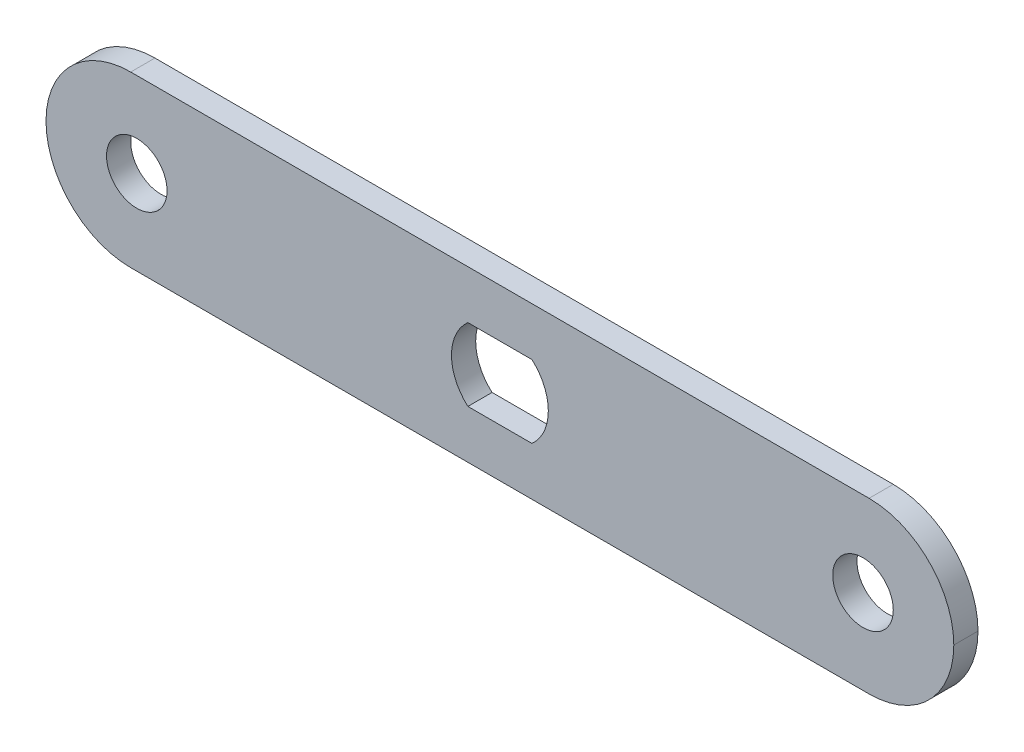
ISO-10303-21;
HEADER;
FILE_DESCRIPTION(('STEP AP214'),'2;1');
FILE_NAME('part.step','',(''),(''),'','','');
FILE_SCHEMA(('AUTOMOTIVE_DESIGN { 1 0 10303 214 1 1 1 1 }'));
ENDSEC;
DATA;
#1=APPLICATION_CONTEXT('core data for automotive mechanical design processes');
#2=APPLICATION_PROTOCOL_DEFINITION('international standard','automotive_design',2000,#1);
#3=PRODUCT_CONTEXT('',#1,'mechanical');
#4=PRODUCT('Part','Part','',(#3));
#5=PRODUCT_RELATED_PRODUCT_CATEGORY('part','',(#4));
#6=PRODUCT_DEFINITION_FORMATION('','',#4);
#7=PRODUCT_DEFINITION_CONTEXT('part definition',#1,'design');
#8=PRODUCT_DEFINITION('design','',#6,#7);
#9=PRODUCT_DEFINITION_SHAPE('','',#8);
#10=(LENGTH_UNIT() NAMED_UNIT(*) SI_UNIT(.MILLI.,.METRE.));
#11=(NAMED_UNIT(*) PLANE_ANGLE_UNIT() SI_UNIT($,.RADIAN.));
#12=(NAMED_UNIT(*) SI_UNIT($,.STERADIAN.) SOLID_ANGLE_UNIT());
#13=UNCERTAINTY_MEASURE_WITH_UNIT(LENGTH_MEASURE(1.E-05),#10,'distance_accuracy_value','');
#14=(GEOMETRIC_REPRESENTATION_CONTEXT(3) GLOBAL_UNCERTAINTY_ASSIGNED_CONTEXT((#13)) GLOBAL_UNIT_ASSIGNED_CONTEXT((#10,
#11,#12)) REPRESENTATION_CONTEXT('',''));
#15=CARTESIAN_POINT('',(0.,0.,0.));
#16=DIRECTION('',(0.,0.,1.));
#17=DIRECTION('',(1.,0.,0.));
#18=AXIS2_PLACEMENT_3D('',#15,#16,#17);
#19=CARTESIAN_POINT('',(0.,0.,2.));
#20=DIRECTION('',(0.,0.,-1.));
#21=DIRECTION('',(-1.,0.,0.));
#22=AXIS2_PLACEMENT_3D('',#19,#20,#21);
#23=PLANE('',#22);
#24=DIRECTION('',(1.,0.,0.));
#25=VECTOR('',#24,1.);
#26=CARTESIAN_POINT('',(-37.5,-7.,2.));
#27=LINE('',#26,#25);
#28=CARTESIAN_POINT('',(-30.5,-7.,2.));
#29=VERTEX_POINT('',#28);
#30=CARTESIAN_POINT('',(30.5,-7.,2.));
#31=VERTEX_POINT('',#30);
#32=EDGE_CURVE('E191',#29,#31,#27,.T.);
#33=ORIENTED_EDGE('',*,*,#32,.T.);
#34=CARTESIAN_POINT('',(30.5,0.,2.));
#35=DIRECTION('',(0.,0.,-1.));
#36=DIRECTION('',(-1.,0.,0.));
#37=AXIS2_PLACEMENT_3D('',#34,#35,#36);
#38=CIRCLE('',#37,7.);
#39=CARTESIAN_POINT('',(37.5,0.,2.));
#40=VERTEX_POINT('',#39);
#41=EDGE_CURVE('E226',#31,#40,#38,.F.);
#42=ORIENTED_EDGE('',*,*,#41,.T.);
#43=CARTESIAN_POINT('',(30.5,0.,2.));
#44=DIRECTION('',(0.,0.,-1.));
#45=DIRECTION('',(-1.,0.,0.));
#46=AXIS2_PLACEMENT_3D('',#43,#44,#45);
#47=CIRCLE('',#46,7.);
#48=CARTESIAN_POINT('',(30.5,7.,2.));
#49=VERTEX_POINT('',#48);
#50=EDGE_CURVE('E223',#40,#49,#47,.F.);
#51=ORIENTED_EDGE('',*,*,#50,.T.);
#52=DIRECTION('',(-1.,0.,0.));
#53=VECTOR('',#52,1.);
#54=CARTESIAN_POINT('',(-37.5,7.,2.));
#55=LINE('',#54,#53);
#56=CARTESIAN_POINT('',(-30.5,7.,2.));
#57=VERTEX_POINT('',#56);
#58=EDGE_CURVE('E200',#49,#57,#55,.T.);
#59=ORIENTED_EDGE('',*,*,#58,.T.);
#60=CARTESIAN_POINT('',(-30.5,0.,2.));
#61=DIRECTION('',(0.,0.,-1.));
#62=DIRECTION('',(-1.,0.,0.));
#63=AXIS2_PLACEMENT_3D('',#60,#61,#62);
#64=CIRCLE('',#63,7.);
#65=CARTESIAN_POINT('',(-37.5,0.,2.));
#66=VERTEX_POINT('',#65);
#67=EDGE_CURVE('E217',#57,#66,#64,.F.);
#68=ORIENTED_EDGE('',*,*,#67,.T.);
#69=CARTESIAN_POINT('',(-30.5,0.,2.));
#70=DIRECTION('',(0.,0.,-1.));
#71=DIRECTION('',(-1.,0.,0.));
#72=AXIS2_PLACEMENT_3D('',#69,#70,#71);
#73=CIRCLE('',#72,7.);
#74=EDGE_CURVE('E220',#66,#29,#73,.F.);
#75=ORIENTED_EDGE('',*,*,#74,.T.);
#76=EDGE_LOOP('',(#33,#42,#51,#59,#68,#75));
#77=FACE_BOUND('',#76,.T.);
#78=CARTESIAN_POINT('',(-30.,0.,2.));
#79=DIRECTION('',(0.,0.,1.));
#80=DIRECTION('',(1.,0.,0.));
#81=AXIS2_PLACEMENT_3D('',#78,#79,#80);
#82=CIRCLE('',#81,2.5);
#83=CARTESIAN_POINT('',(-27.5,0.,2.));
#84=VERTEX_POINT('',#83);
#85=EDGE_CURVE('E183',#84,#84,#82,.T.);
#86=ORIENTED_EDGE('',*,*,#85,.F.);
#87=EDGE_LOOP('',(#86));
#88=FACE_BOUND('',#87,.T.);
#89=CARTESIAN_POINT('',(30.,0.,2.));
#90=DIRECTION('',(0.,0.,1.));
#91=DIRECTION('',(1.,0.,0.));
#92=AXIS2_PLACEMENT_3D('',#89,#90,#91);
#93=CIRCLE('',#92,2.5);
#94=CARTESIAN_POINT('',(32.5,0.,2.));
#95=VERTEX_POINT('',#94);
#96=EDGE_CURVE('E145',#95,#95,#93,.T.);
#97=ORIENTED_EDGE('',*,*,#96,.F.);
#98=EDGE_LOOP('',(#97));
#99=FACE_BOUND('',#98,.T.);
#100=CARTESIAN_POINT('',(0.,0.,2.));
#101=DIRECTION('',(0.,0.,1.));
#102=DIRECTION('',(-1.,0.,0.));
#103=AXIS2_PLACEMENT_3D('',#100,#101,#102);
#104=CIRCLE('',#103,4.);
#105=CARTESIAN_POINT('',(2.64575131106459,-3.,2.));
#106=VERTEX_POINT('',#105);
#107=CARTESIAN_POINT('',(2.64575131106459,3.,2.));
#108=VERTEX_POINT('',#107);
#109=EDGE_CURVE('E125',#106,#108,#104,.T.);
#110=ORIENTED_EDGE('',*,*,#109,.F.);
#111=DIRECTION('',(1.,0.,0.));
#112=VECTOR('',#111,1.);
#113=CARTESIAN_POINT('',(-2.64575131106459,-3.,2.));
#114=LINE('',#113,#112);
#115=CARTESIAN_POINT('',(-2.64575131106459,-3.,2.));
#116=VERTEX_POINT('',#115);
#117=EDGE_CURVE('E154',#116,#106,#114,.T.);
#118=ORIENTED_EDGE('',*,*,#117,.F.);
#119=CARTESIAN_POINT('',(0.,0.,2.));
#120=DIRECTION('',(0.,0.,1.));
#121=DIRECTION('',(1.,0.,0.));
#122=AXIS2_PLACEMENT_3D('',#119,#120,#121);
#123=CIRCLE('',#122,4.);
#124=CARTESIAN_POINT('',(-2.64575131106459,3.,2.));
#125=VERTEX_POINT('',#124);
#126=EDGE_CURVE('E150',#125,#116,#123,.T.);
#127=ORIENTED_EDGE('',*,*,#126,.F.);
#128=DIRECTION('',(-1.,0.,0.));
#129=VECTOR('',#128,1.);
#130=CARTESIAN_POINT('',(-2.64575131106459,3.,2.));
#131=LINE('',#130,#129);
#132=EDGE_CURVE('E136',#108,#125,#131,.T.);
#133=ORIENTED_EDGE('',*,*,#132,.F.);
#134=EDGE_LOOP('',(#110,#118,#127,#133));
#135=FACE_BOUND('',#134,.T.);
#136=ADVANCED_FACE('F45',(#77,#88,#99,#135),#23,.F.);
#137=CARTESIAN_POINT('',(0.,0.,0.));
#138=DIRECTION('',(0.,0.,-1.));
#139=DIRECTION('',(-1.,0.,0.));
#140=AXIS2_PLACEMENT_3D('',#137,#138,#139);
#141=PLANE('',#140);
#142=CARTESIAN_POINT('',(30.5,0.,0.));
#143=DIRECTION('',(0.,0.,-1.));
#144=DIRECTION('',(-1.,0.,0.));
#145=AXIS2_PLACEMENT_3D('',#142,#143,#144);
#146=CIRCLE('',#145,7.);
#147=CARTESIAN_POINT('',(30.5,7.,0.));
#148=VERTEX_POINT('',#147);
#149=CARTESIAN_POINT('',(37.5,0.,0.));
#150=VERTEX_POINT('',#149);
#151=EDGE_CURVE('E63',#148,#150,#146,.T.);
#152=ORIENTED_EDGE('',*,*,#151,.T.);
#153=CARTESIAN_POINT('',(30.5,0.,0.));
#154=DIRECTION('',(0.,0.,-1.));
#155=DIRECTION('',(-1.,0.,0.));
#156=AXIS2_PLACEMENT_3D('',#153,#154,#155);
#157=CIRCLE('',#156,7.);
#158=CARTESIAN_POINT('',(30.5,-7.,0.));
#159=VERTEX_POINT('',#158);
#160=EDGE_CURVE('E236',#150,#159,#157,.T.);
#161=ORIENTED_EDGE('',*,*,#160,.T.);
#162=DIRECTION('',(1.,0.,0.));
#163=VECTOR('',#162,1.);
#164=CARTESIAN_POINT('',(-37.5,-7.,0.));
#165=LINE('',#164,#163);
#166=CARTESIAN_POINT('',(-30.5,-7.,0.));
#167=VERTEX_POINT('',#166);
#168=EDGE_CURVE('E195',#167,#159,#165,.T.);
#169=ORIENTED_EDGE('',*,*,#168,.F.);
#170=CARTESIAN_POINT('',(-30.5,0.,0.));
#171=DIRECTION('',(0.,0.,-1.));
#172=DIRECTION('',(-1.,0.,0.));
#173=AXIS2_PLACEMENT_3D('',#170,#171,#172);
#174=CIRCLE('',#173,7.);
#175=CARTESIAN_POINT('',(-37.5,0.,0.));
#176=VERTEX_POINT('',#175);
#177=EDGE_CURVE('E231',#167,#176,#174,.T.);
#178=ORIENTED_EDGE('',*,*,#177,.T.);
#179=CARTESIAN_POINT('',(-30.5,0.,0.));
#180=DIRECTION('',(0.,0.,-1.));
#181=DIRECTION('',(-1.,0.,0.));
#182=AXIS2_PLACEMENT_3D('',#179,#180,#181);
#183=CIRCLE('',#182,7.);
#184=CARTESIAN_POINT('',(-30.5,7.,0.));
#185=VERTEX_POINT('',#184);
#186=EDGE_CURVE('E69',#176,#185,#183,.T.);
#187=ORIENTED_EDGE('',*,*,#186,.T.);
#188=DIRECTION('',(-1.,0.,0.));
#189=VECTOR('',#188,1.);
#190=CARTESIAN_POINT('',(-37.5,7.,0.));
#191=LINE('',#190,#189);
#192=EDGE_CURVE('E199',#148,#185,#191,.T.);
#193=ORIENTED_EDGE('',*,*,#192,.F.);
#194=EDGE_LOOP('',(#152,#161,#169,#178,#187,#193));
#195=FACE_BOUND('',#194,.T.);
#196=CARTESIAN_POINT('',(-30.,0.,0.));
#197=DIRECTION('',(0.,0.,1.));
#198=DIRECTION('',(1.,0.,0.));
#199=AXIS2_PLACEMENT_3D('',#196,#197,#198);
#200=CIRCLE('',#199,2.5);
#201=CARTESIAN_POINT('',(-27.5,0.,0.));
#202=VERTEX_POINT('',#201);
#203=EDGE_CURVE('E187',#202,#202,#200,.T.);
#204=ORIENTED_EDGE('',*,*,#203,.T.);
#205=EDGE_LOOP('',(#204));
#206=FACE_BOUND('',#205,.T.);
#207=CARTESIAN_POINT('',(30.,0.,0.));
#208=DIRECTION('',(0.,0.,1.));
#209=DIRECTION('',(1.,0.,0.));
#210=AXIS2_PLACEMENT_3D('',#207,#208,#209);
#211=CIRCLE('',#210,2.5);
#212=CARTESIAN_POINT('',(32.5,0.,0.));
#213=VERTEX_POINT('',#212);
#214=EDGE_CURVE('E179',#213,#213,#211,.T.);
#215=ORIENTED_EDGE('',*,*,#214,.T.);
#216=EDGE_LOOP('',(#215));
#217=FACE_BOUND('',#216,.T.);
#218=DIRECTION('',(1.,0.,0.));
#219=VECTOR('',#218,1.);
#220=CARTESIAN_POINT('',(-2.64575131106459,-3.,0.));
#221=LINE('',#220,#219);
#222=CARTESIAN_POINT('',(-2.64575131106459,-3.,0.));
#223=VERTEX_POINT('',#222);
#224=CARTESIAN_POINT('',(2.64575131106459,-3.,0.));
#225=VERTEX_POINT('',#224);
#226=EDGE_CURVE('E137',#223,#225,#221,.T.);
#227=ORIENTED_EDGE('',*,*,#226,.T.);
#228=CARTESIAN_POINT('',(0.,0.,0.));
#229=DIRECTION('',(0.,0.,1.));
#230=DIRECTION('',(-1.,0.,0.));
#231=AXIS2_PLACEMENT_3D('',#228,#229,#230);
#232=CIRCLE('',#231,4.);
#233=CARTESIAN_POINT('',(2.64575131106459,3.,0.));
#234=VERTEX_POINT('',#233);
#235=EDGE_CURVE('E159',#225,#234,#232,.T.);
#236=ORIENTED_EDGE('',*,*,#235,.T.);
#237=DIRECTION('',(-1.,0.,0.));
#238=VECTOR('',#237,1.);
#239=CARTESIAN_POINT('',(-2.64575131106459,3.,0.));
#240=LINE('',#239,#238);
#241=CARTESIAN_POINT('',(-2.64575131106459,3.,0.));
#242=VERTEX_POINT('',#241);
#243=EDGE_CURVE('E143',#234,#242,#240,.T.);
#244=ORIENTED_EDGE('',*,*,#243,.T.);
#245=CARTESIAN_POINT('',(0.,0.,0.));
#246=DIRECTION('',(0.,0.,1.));
#247=DIRECTION('',(1.,0.,0.));
#248=AXIS2_PLACEMENT_3D('',#245,#246,#247);
#249=CIRCLE('',#248,4.);
#250=EDGE_CURVE('E165',#242,#223,#249,.T.);
#251=ORIENTED_EDGE('',*,*,#250,.T.);
#252=EDGE_LOOP('',(#227,#236,#244,#251));
#253=FACE_BOUND('',#252,.T.);
#254=ADVANCED_FACE('F263',(#195,#206,#217,#253),#141,.T.);
#255=CARTESIAN_POINT('',(-37.5,-7.,0.));
#256=DIRECTION('',(0.,-1.,0.));
#257=DIRECTION('',(0.,0.,-1.));
#258=AXIS2_PLACEMENT_3D('',#255,#256,#257);
#259=PLANE('',#258);
#260=ORIENTED_EDGE('',*,*,#168,.T.);
#261=DIRECTION('',(0.,0.,1.));
#262=VECTOR('',#261,1.);
#263=CARTESIAN_POINT('',(30.5,-7.,0.));
#264=LINE('',#263,#262);
#265=EDGE_CURVE('E213',#159,#31,#264,.T.);
#266=ORIENTED_EDGE('',*,*,#265,.T.);
#267=ORIENTED_EDGE('',*,*,#32,.F.);
#268=DIRECTION('',(0.,0.,1.));
#269=VECTOR('',#268,1.);
#270=CARTESIAN_POINT('',(-30.5,-7.,0.));
#271=LINE('',#270,#269);
#272=EDGE_CURVE('E203',#29,#167,#271,.F.);
#273=ORIENTED_EDGE('',*,*,#272,.T.);
#274=EDGE_LOOP('',(#260,#266,#267,#273));
#275=FACE_BOUND('',#274,.T.);
#276=ADVANCED_FACE('F266',(#275),#259,.T.);
#277=CARTESIAN_POINT('',(-37.5,7.,0.));
#278=DIRECTION('',(0.,1.,0.));
#279=DIRECTION('',(0.,0.,1.));
#280=AXIS2_PLACEMENT_3D('',#277,#278,#279);
#281=PLANE('',#280);
#282=ORIENTED_EDGE('',*,*,#58,.F.);
#283=DIRECTION('',(0.,0.,1.));
#284=VECTOR('',#283,1.);
#285=CARTESIAN_POINT('',(30.5,7.,0.));
#286=LINE('',#285,#284);
#287=EDGE_CURVE('E11',#49,#148,#286,.F.);
#288=ORIENTED_EDGE('',*,*,#287,.T.);
#289=ORIENTED_EDGE('',*,*,#192,.T.);
#290=DIRECTION('',(0.,0.,1.));
#291=VECTOR('',#290,1.);
#292=CARTESIAN_POINT('',(-30.5,7.,0.));
#293=LINE('',#292,#291);
#294=EDGE_CURVE('E55',#185,#57,#293,.T.);
#295=ORIENTED_EDGE('',*,*,#294,.T.);
#296=EDGE_LOOP('',(#282,#288,#289,#295));
#297=FACE_BOUND('',#296,.T.);
#298=ADVANCED_FACE('F256',(#297),#281,.T.);
#299=CARTESIAN_POINT('',(-30.,0.,0.));
#300=DIRECTION('',(0.,0.,1.));
#301=DIRECTION('',(1.,0.,0.));
#302=AXIS2_PLACEMENT_3D('',#299,#300,#301);
#303=CYLINDRICAL_SURFACE('',#302,2.5);
#304=ORIENTED_EDGE('',*,*,#203,.F.);
#305=EDGE_LOOP('',(#304));
#306=FACE_BOUND('',#305,.T.);
#307=ORIENTED_EDGE('',*,*,#85,.T.);
#308=EDGE_LOOP('',(#307));
#309=FACE_BOUND('',#308,.T.);
#310=ADVANCED_FACE('F321',(#306,#309),#303,.F.);
#311=CARTESIAN_POINT('',(30.,0.,0.));
#312=DIRECTION('',(0.,0.,1.));
#313=DIRECTION('',(1.,0.,0.));
#314=AXIS2_PLACEMENT_3D('',#311,#312,#313);
#315=CYLINDRICAL_SURFACE('',#314,2.5);
#316=ORIENTED_EDGE('',*,*,#214,.F.);
#317=EDGE_LOOP('',(#316));
#318=FACE_BOUND('',#317,.T.);
#319=ORIENTED_EDGE('',*,*,#96,.T.);
#320=EDGE_LOOP('',(#319));
#321=FACE_BOUND('',#320,.T.);
#322=ADVANCED_FACE('F341',(#318,#321),#315,.F.);
#323=CARTESIAN_POINT('',(0.,0.,2.));
#324=DIRECTION('',(0.,0.,-1.));
#325=DIRECTION('',(-1.,0.,0.));
#326=AXIS2_PLACEMENT_3D('',#323,#324,#325);
#327=CYLINDRICAL_SURFACE('',#326,4.);
#328=ORIENTED_EDGE('',*,*,#235,.F.);
#329=DIRECTION('',(0.,0.,-1.));
#330=VECTOR('',#329,1.);
#331=CARTESIAN_POINT('',(2.64575131106459,-3.,2.));
#332=LINE('',#331,#330);
#333=EDGE_CURVE('E131',#106,#225,#332,.T.);
#334=ORIENTED_EDGE('',*,*,#333,.F.);
#335=ORIENTED_EDGE('',*,*,#109,.T.);
#336=DIRECTION('',(0.,0.,-1.));
#337=VECTOR('',#336,1.);
#338=CARTESIAN_POINT('',(2.64575131106459,3.,2.));
#339=LINE('',#338,#337);
#340=EDGE_CURVE('E128',#108,#234,#339,.T.);
#341=ORIENTED_EDGE('',*,*,#340,.T.);
#342=EDGE_LOOP('',(#328,#334,#335,#341));
#343=FACE_BOUND('',#342,.T.);
#344=ADVANCED_FACE('F127',(#343),#327,.F.);
#345=CARTESIAN_POINT('',(-2.64575131106459,3.,2.));
#346=DIRECTION('',(0.,-1.,0.));
#347=DIRECTION('',(1.,0.,0.));
#348=AXIS2_PLACEMENT_3D('',#345,#346,#347);
#349=PLANE('',#348);
#350=ORIENTED_EDGE('',*,*,#243,.F.);
#351=ORIENTED_EDGE('',*,*,#340,.F.);
#352=ORIENTED_EDGE('',*,*,#132,.T.);
#353=DIRECTION('',(0.,0.,-1.));
#354=VECTOR('',#353,1.);
#355=CARTESIAN_POINT('',(-2.64575131106459,3.,2.));
#356=LINE('',#355,#354);
#357=EDGE_CURVE('E146',#125,#242,#356,.T.);
#358=ORIENTED_EDGE('',*,*,#357,.T.);
#359=EDGE_LOOP('',(#350,#351,#352,#358));
#360=FACE_BOUND('',#359,.T.);
#361=ADVANCED_FACE('F140',(#360),#349,.T.);
#362=CARTESIAN_POINT('',(0.,0.,2.));
#363=DIRECTION('',(0.,0.,-1.));
#364=DIRECTION('',(-1.,0.,0.));
#365=AXIS2_PLACEMENT_3D('',#362,#363,#364);
#366=CYLINDRICAL_SURFACE('',#365,4.);
#367=ORIENTED_EDGE('',*,*,#250,.F.);
#368=ORIENTED_EDGE('',*,*,#357,.F.);
#369=ORIENTED_EDGE('',*,*,#126,.T.);
#370=DIRECTION('',(0.,0.,-1.));
#371=VECTOR('',#370,1.);
#372=CARTESIAN_POINT('',(-2.64575131106459,-3.,2.));
#373=LINE('',#372,#371);
#374=EDGE_CURVE('E174',#116,#223,#373,.T.);
#375=ORIENTED_EDGE('',*,*,#374,.T.);
#376=EDGE_LOOP('',(#367,#368,#369,#375));
#377=FACE_BOUND('',#376,.T.);
#378=ADVANCED_FACE('F277',(#377),#366,.F.);
#379=CARTESIAN_POINT('',(-2.64575131106459,-3.,2.));
#380=DIRECTION('',(0.,1.,0.));
#381=DIRECTION('',(-1.,0.,0.));
#382=AXIS2_PLACEMENT_3D('',#379,#380,#381);
#383=PLANE('',#382);
#384=ORIENTED_EDGE('',*,*,#226,.F.);
#385=ORIENTED_EDGE('',*,*,#374,.F.);
#386=ORIENTED_EDGE('',*,*,#117,.T.);
#387=ORIENTED_EDGE('',*,*,#333,.T.);
#388=EDGE_LOOP('',(#384,#385,#386,#387));
#389=FACE_BOUND('',#388,.T.);
#390=ADVANCED_FACE('F275',(#389),#383,.T.);
#391=CARTESIAN_POINT('',(30.5,0.,0.));
#392=DIRECTION('',(0.,0.,1.));
#393=DIRECTION('',(1.,0.,0.));
#394=AXIS2_PLACEMENT_3D('',#391,#392,#393);
#395=CYLINDRICAL_SURFACE('',#394,7.);
#396=DIRECTION('',(0.,0.,1.));
#397=VECTOR('',#396,1.);
#398=CARTESIAN_POINT('',(37.5,0.,0.));
#399=LINE('',#398,#397);
#400=EDGE_CURVE('E162',#150,#40,#399,.T.);
#401=ORIENTED_EDGE('',*,*,#400,.F.);
#402=ORIENTED_EDGE('',*,*,#151,.F.);
#403=ORIENTED_EDGE('',*,*,#287,.F.);
#404=ORIENTED_EDGE('',*,*,#50,.F.);
#405=EDGE_LOOP('',(#401,#402,#403,#404));
#406=FACE_BOUND('',#405,.T.);
#407=ADVANCED_FACE('F262',(#406),#395,.T.);
#408=CARTESIAN_POINT('',(30.5,0.,0.));
#409=DIRECTION('',(0.,0.,1.));
#410=DIRECTION('',(1.,0.,0.));
#411=AXIS2_PLACEMENT_3D('',#408,#409,#410);
#412=CYLINDRICAL_SURFACE('',#411,7.);
#413=ORIENTED_EDGE('',*,*,#160,.F.);
#414=ORIENTED_EDGE('',*,*,#400,.T.);
#415=ORIENTED_EDGE('',*,*,#41,.F.);
#416=ORIENTED_EDGE('',*,*,#265,.F.);
#417=EDGE_LOOP('',(#413,#414,#415,#416));
#418=FACE_BOUND('',#417,.T.);
#419=ADVANCED_FACE('F293',(#418),#412,.T.);
#420=CARTESIAN_POINT('',(-30.5,0.,0.));
#421=DIRECTION('',(0.,0.,1.));
#422=DIRECTION('',(1.,0.,0.));
#423=AXIS2_PLACEMENT_3D('',#420,#421,#422);
#424=CYLINDRICAL_SURFACE('',#423,7.);
#425=ORIENTED_EDGE('',*,*,#294,.F.);
#426=ORIENTED_EDGE('',*,*,#186,.F.);
#427=DIRECTION('',(0.,0.,1.));
#428=VECTOR('',#427,1.);
#429=CARTESIAN_POINT('',(-37.5,0.,0.));
#430=LINE('',#429,#428);
#431=EDGE_CURVE('E49',#66,#176,#430,.F.);
#432=ORIENTED_EDGE('',*,*,#431,.F.);
#433=ORIENTED_EDGE('',*,*,#67,.F.);
#434=EDGE_LOOP('',(#425,#426,#432,#433));
#435=FACE_BOUND('',#434,.T.);
#436=ADVANCED_FACE('F47',(#435),#424,.T.);
#437=CARTESIAN_POINT('',(-30.5,0.,0.));
#438=DIRECTION('',(0.,0.,1.));
#439=DIRECTION('',(1.,0.,0.));
#440=AXIS2_PLACEMENT_3D('',#437,#438,#439);
#441=CYLINDRICAL_SURFACE('',#440,7.);
#442=ORIENTED_EDGE('',*,*,#177,.F.);
#443=ORIENTED_EDGE('',*,*,#272,.F.);
#444=ORIENTED_EDGE('',*,*,#74,.F.);
#445=ORIENTED_EDGE('',*,*,#431,.T.);
#446=EDGE_LOOP('',(#442,#443,#444,#445));
#447=FACE_BOUND('',#446,.T.);
#448=ADVANCED_FACE('F249',(#447),#441,.T.);
#449=CLOSED_SHELL('',(#136,#254,#276,#298,#310,#322,#344,#361,#378,#390,#407,#419,#436,#448));
#450=MANIFOLD_SOLID_BREP('B2',#449);
#451=ADVANCED_BREP_SHAPE_REPRESENTATION('',(#18,#450),#14);
#452=SHAPE_DEFINITION_REPRESENTATION(#9,#451);
ENDSEC;
END-ISO-10303-21;
